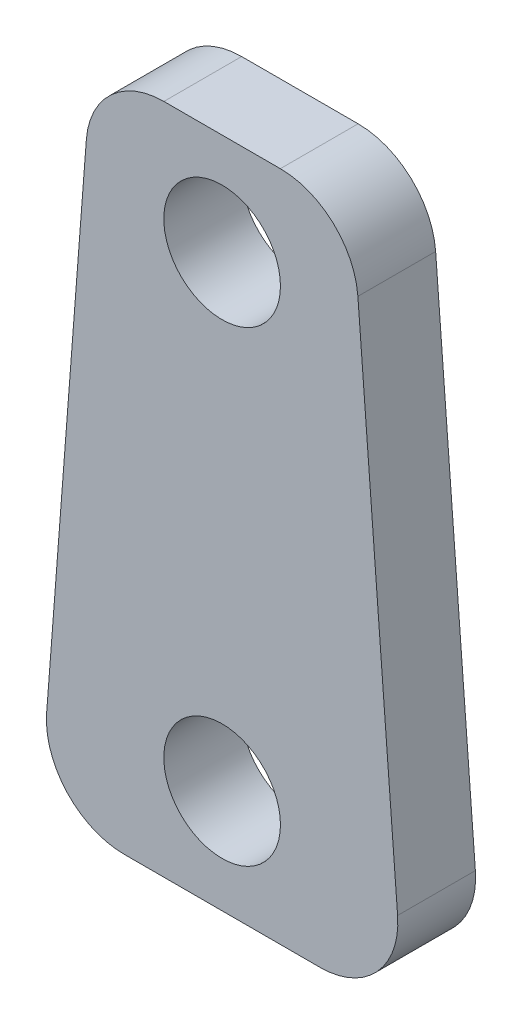
ISO-10303-21;
HEADER;
FILE_DESCRIPTION(('STEP AP214'),'2;1');
FILE_NAME('part.step','',(''),(''),'','','');
FILE_SCHEMA(('AUTOMOTIVE_DESIGN { 1 0 10303 214 1 1 1 1 }'));
ENDSEC;
DATA;
#1=APPLICATION_CONTEXT('core data for automotive mechanical design processes');
#2=APPLICATION_PROTOCOL_DEFINITION('international standard','automotive_design',2000,#1);
#3=PRODUCT_CONTEXT('',#1,'mechanical');
#4=PRODUCT('Part','Part','',(#3));
#5=PRODUCT_RELATED_PRODUCT_CATEGORY('part','',(#4));
#6=PRODUCT_DEFINITION_FORMATION('','',#4);
#7=PRODUCT_DEFINITION_CONTEXT('part definition',#1,'design');
#8=PRODUCT_DEFINITION('design','',#6,#7);
#9=PRODUCT_DEFINITION_SHAPE('','',#8);
#10=(LENGTH_UNIT() NAMED_UNIT(*) SI_UNIT(.MILLI.,.METRE.));
#11=(NAMED_UNIT(*) PLANE_ANGLE_UNIT() SI_UNIT($,.RADIAN.));
#12=(NAMED_UNIT(*) SI_UNIT($,.STERADIAN.) SOLID_ANGLE_UNIT());
#13=UNCERTAINTY_MEASURE_WITH_UNIT(LENGTH_MEASURE(1.E-05),#10,'distance_accuracy_value','');
#14=(GEOMETRIC_REPRESENTATION_CONTEXT(3) GLOBAL_UNCERTAINTY_ASSIGNED_CONTEXT((#13)) GLOBAL_UNIT_ASSIGNED_CONTEXT((#10,
#11,#12)) REPRESENTATION_CONTEXT('',''));
#15=CARTESIAN_POINT('',(0.,0.,0.));
#16=DIRECTION('',(0.,0.,1.));
#17=DIRECTION('',(1.,0.,0.));
#18=AXIS2_PLACEMENT_3D('',#15,#16,#17);
#19=CARTESIAN_POINT('',(-2.37756908156125,134.069666666667,3.175));
#20=DIRECTION('',(0.,0.,-1.));
#21=DIRECTION('',(-1.,0.,0.));
#22=AXIS2_PLACEMENT_3D('',#19,#20,#21);
#23=CYLINDRICAL_SURFACE('',#22,3.17500000000001);
#24=CARTESIAN_POINT('',(-2.37756908156125,134.069666666667,0.));
#25=DIRECTION('',(0.,0.,1.));
#26=DIRECTION('',(1.,0.,0.));
#27=AXIS2_PLACEMENT_3D('',#24,#25,#26);
#28=CIRCLE('',#27,3.17500000000001);
#29=CARTESIAN_POINT('',(-5.54321707302877,134.313178050626,0.));
#30=VERTEX_POINT('',#29);
#31=CARTESIAN_POINT('',(-2.37756908156123,137.244666666667,0.));
#32=VERTEX_POINT('',#31);
#33=EDGE_CURVE('E134',#30,#32,#28,.F.);
#34=ORIENTED_EDGE('',*,*,#33,.F.);
#35=DIRECTION('',(0.,0.,-1.));
#36=VECTOR('',#35,1.);
#37=CARTESIAN_POINT('',(-5.54321707302877,134.313178050626,3.175));
#38=LINE('',#37,#36);
#39=CARTESIAN_POINT('',(-5.54321707302877,134.313178050626,3.175));
#40=VERTEX_POINT('',#39);
#41=EDGE_CURVE('E11',#40,#30,#38,.T.);
#42=ORIENTED_EDGE('',*,*,#41,.F.);
#43=CARTESIAN_POINT('',(-2.37756908156125,134.069666666667,3.175));
#44=DIRECTION('',(0.,0.,1.));
#45=DIRECTION('',(1.,0.,0.));
#46=AXIS2_PLACEMENT_3D('',#43,#44,#45);
#47=CIRCLE('',#46,3.17500000000001);
#48=CARTESIAN_POINT('',(-2.37756908156123,137.244666666667,3.175));
#49=VERTEX_POINT('',#48);
#50=EDGE_CURVE('E292',#40,#49,#47,.F.);
#51=ORIENTED_EDGE('',*,*,#50,.T.);
#52=DIRECTION('',(0.,0.,-1.));
#53=VECTOR('',#52,1.);
#54=CARTESIAN_POINT('',(-2.37756908156123,137.244666666667,3.175));
#55=LINE('',#54,#53);
#56=EDGE_CURVE('E50',#49,#32,#55,.T.);
#57=ORIENTED_EDGE('',*,*,#56,.T.);
#58=EDGE_LOOP('',(#34,#42,#51,#57));
#59=FACE_BOUND('',#58,.T.);
#60=ADVANCED_FACE('F33',(#59),#23,.T.);
#61=CARTESIAN_POINT('',(-15.7816176470588,1.2139705882353,3.175));
#62=DIRECTION('',(-0.997054485501582,0.0766964988847372,0.));
#63=DIRECTION('',(-0.0766964988847372,-0.997054485501582,0.));
#64=AXIS2_PLACEMENT_3D('',#61,#62,#63);
#65=PLANE('',#64);
#66=DIRECTION('',(0.0766964988847372,0.997054485501582,0.));
#67=VECTOR('',#66,1.);
#68=CARTESIAN_POINT('',(-15.7816176470588,1.2139705882353,0.));
#69=LINE('',#68,#67);
#70=CARTESIAN_POINT('',(-7.16490938072108,113.231178050626,0.));
#71=VERTEX_POINT('',#70);
#72=EDGE_CURVE('E136',#71,#30,#69,.T.);
#73=ORIENTED_EDGE('',*,*,#72,.F.);
#74=DIRECTION('',(0.,0.,-1.));
#75=VECTOR('',#74,1.);
#76=CARTESIAN_POINT('',(-7.16490938072108,113.231178050626,3.175));
#77=LINE('',#76,#75);
#78=CARTESIAN_POINT('',(-7.16490938072108,113.231178050626,3.175));
#79=VERTEX_POINT('',#78);
#80=EDGE_CURVE('E42',#79,#71,#77,.T.);
#81=ORIENTED_EDGE('',*,*,#80,.F.);
#82=DIRECTION('',(0.0766964988847372,0.997054485501582,0.));
#83=VECTOR('',#82,1.);
#84=CARTESIAN_POINT('',(-15.7816176470588,1.2139705882353,3.175));
#85=LINE('',#84,#83);
#86=EDGE_CURVE('E176',#79,#40,#85,.T.);
#87=ORIENTED_EDGE('',*,*,#86,.T.);
#88=ORIENTED_EDGE('',*,*,#41,.T.);
#89=EDGE_LOOP('',(#73,#81,#87,#88));
#90=FACE_BOUND('',#89,.T.);
#91=ADVANCED_FACE('F175',(#90),#65,.T.);
#92=CARTESIAN_POINT('',(-3.99926138925356,112.987666666667,3.175));
#93=DIRECTION('',(0.,0.,-1.));
#94=DIRECTION('',(-1.,0.,0.));
#95=AXIS2_PLACEMENT_3D('',#92,#93,#94);
#96=CYLINDRICAL_SURFACE('',#95,3.175);
#97=CARTESIAN_POINT('',(-3.99926138925356,112.987666666667,0.));
#98=DIRECTION('',(0.,0.,1.));
#99=DIRECTION('',(1.,0.,0.));
#100=AXIS2_PLACEMENT_3D('',#97,#98,#99);
#101=CIRCLE('',#100,3.175);
#102=CARTESIAN_POINT('',(-3.99926138925354,109.812666666667,0.));
#103=VERTEX_POINT('',#102);
#104=EDGE_CURVE('E139',#71,#103,#101,.T.);
#105=ORIENTED_EDGE('',*,*,#104,.T.);
#106=DIRECTION('',(0.,0.,-1.));
#107=VECTOR('',#106,1.);
#108=CARTESIAN_POINT('',(-3.99926138925354,109.812666666667,3.175));
#109=LINE('',#108,#107);
#110=CARTESIAN_POINT('',(-3.99926138925354,109.812666666667,3.175));
#111=VERTEX_POINT('',#110);
#112=EDGE_CURVE('E160',#111,#103,#109,.T.);
#113=ORIENTED_EDGE('',*,*,#112,.F.);
#114=CARTESIAN_POINT('',(-3.99926138925356,112.987666666667,3.175));
#115=DIRECTION('',(0.,0.,1.));
#116=DIRECTION('',(1.,0.,0.));
#117=AXIS2_PLACEMENT_3D('',#114,#115,#116);
#118=CIRCLE('',#117,3.175);
#119=EDGE_CURVE('E168',#79,#111,#118,.T.);
#120=ORIENTED_EDGE('',*,*,#119,.F.);
#121=ORIENTED_EDGE('',*,*,#80,.T.);
#122=EDGE_LOOP('',(#105,#113,#120,#121));
#123=FACE_BOUND('',#122,.T.);
#124=ADVANCED_FACE('F165',(#123),#96,.T.);
#125=CARTESIAN_POINT('',(0.,109.812666666667,3.175));
#126=DIRECTION('',(0.,1.,0.));
#127=DIRECTION('',(0.,0.,1.));
#128=AXIS2_PLACEMENT_3D('',#125,#126,#127);
#129=PLANE('',#128);
#130=DIRECTION('',(1.,0.,0.));
#131=VECTOR('',#130,1.);
#132=CARTESIAN_POINT('',(0.,109.812666666667,0.));
#133=LINE('',#132,#131);
#134=CARTESIAN_POINT('',(3.99926138925357,109.812666666667,0.));
#135=VERTEX_POINT('',#134);
#136=EDGE_CURVE('E142',#103,#135,#133,.T.);
#137=ORIENTED_EDGE('',*,*,#136,.T.);
#138=DIRECTION('',(0.,0.,-1.));
#139=VECTOR('',#138,1.);
#140=CARTESIAN_POINT('',(3.99926138925357,109.812666666667,3.175));
#141=LINE('',#140,#139);
#142=CARTESIAN_POINT('',(3.99926138925357,109.812666666667,3.175));
#143=VERTEX_POINT('',#142);
#144=EDGE_CURVE('E158',#143,#135,#141,.T.);
#145=ORIENTED_EDGE('',*,*,#144,.F.);
#146=DIRECTION('',(1.,0.,0.));
#147=VECTOR('',#146,1.);
#148=CARTESIAN_POINT('',(0.,109.812666666667,3.175));
#149=LINE('',#148,#147);
#150=EDGE_CURVE('E123',#111,#143,#149,.T.);
#151=ORIENTED_EDGE('',*,*,#150,.F.);
#152=ORIENTED_EDGE('',*,*,#112,.T.);
#153=EDGE_LOOP('',(#137,#145,#151,#152));
#154=FACE_BOUND('',#153,.T.);
#155=ADVANCED_FACE('F258',(#154),#129,.F.);
#156=CARTESIAN_POINT('',(3.9992613892536,112.987666666667,3.175));
#157=DIRECTION('',(0.,0.,-1.));
#158=DIRECTION('',(-1.,0.,0.));
#159=AXIS2_PLACEMENT_3D('',#156,#157,#158);
#160=CYLINDRICAL_SURFACE('',#159,3.175);
#161=CARTESIAN_POINT('',(3.9992613892536,112.987666666667,0.));
#162=DIRECTION('',(0.,0.,1.));
#163=DIRECTION('',(1.,0.,0.));
#164=AXIS2_PLACEMENT_3D('',#161,#162,#163);
#165=CIRCLE('',#164,3.175);
#166=CARTESIAN_POINT('',(7.16490938072112,113.231178050626,0.));
#167=VERTEX_POINT('',#166);
#168=EDGE_CURVE('E145',#167,#135,#165,.F.);
#169=ORIENTED_EDGE('',*,*,#168,.F.);
#170=DIRECTION('',(0.,0.,-1.));
#171=VECTOR('',#170,1.);
#172=CARTESIAN_POINT('',(7.16490938072112,113.231178050626,3.175));
#173=LINE('',#172,#171);
#174=CARTESIAN_POINT('',(7.16490938072112,113.231178050626,3.175));
#175=VERTEX_POINT('',#174);
#176=EDGE_CURVE('E110',#175,#167,#173,.T.);
#177=ORIENTED_EDGE('',*,*,#176,.F.);
#178=CARTESIAN_POINT('',(3.9992613892536,112.987666666667,3.175));
#179=DIRECTION('',(0.,0.,1.));
#180=DIRECTION('',(1.,0.,0.));
#181=AXIS2_PLACEMENT_3D('',#178,#179,#180);
#182=CIRCLE('',#181,3.175);
#183=EDGE_CURVE('E121',#175,#143,#182,.F.);
#184=ORIENTED_EDGE('',*,*,#183,.T.);
#185=ORIENTED_EDGE('',*,*,#144,.T.);
#186=EDGE_LOOP('',(#169,#177,#184,#185));
#187=FACE_BOUND('',#186,.T.);
#188=ADVANCED_FACE('F249',(#187),#160,.T.);
#189=CARTESIAN_POINT('',(15.7816176470588,1.21397058823529,3.175));
#190=DIRECTION('',(0.997054485501582,0.0766964988847368,0.));
#191=DIRECTION('',(-0.0766964988847368,0.997054485501582,0.));
#192=AXIS2_PLACEMENT_3D('',#189,#190,#191);
#193=PLANE('',#192);
#194=DIRECTION('',(0.0766964988847368,-0.997054485501582,0.));
#195=VECTOR('',#194,1.);
#196=CARTESIAN_POINT('',(15.7816176470588,1.21397058823529,0.));
#197=LINE('',#196,#195);
#198=CARTESIAN_POINT('',(5.54321707302882,134.313178050626,0.));
#199=VERTEX_POINT('',#198);
#200=EDGE_CURVE('E107',#199,#167,#197,.T.);
#201=ORIENTED_EDGE('',*,*,#200,.F.);
#202=DIRECTION('',(0.,0.,-1.));
#203=VECTOR('',#202,1.);
#204=CARTESIAN_POINT('',(5.54321707302882,134.313178050626,3.175));
#205=LINE('',#204,#203);
#206=CARTESIAN_POINT('',(5.54321707302882,134.313178050626,3.175));
#207=VERTEX_POINT('',#206);
#208=EDGE_CURVE('E101',#207,#199,#205,.T.);
#209=ORIENTED_EDGE('',*,*,#208,.F.);
#210=DIRECTION('',(0.0766964988847368,-0.997054485501582,0.));
#211=VECTOR('',#210,1.);
#212=CARTESIAN_POINT('',(15.7816176470588,1.21397058823529,3.175));
#213=LINE('',#212,#211);
#214=EDGE_CURVE('E105',#207,#175,#213,.T.);
#215=ORIENTED_EDGE('',*,*,#214,.T.);
#216=ORIENTED_EDGE('',*,*,#176,.T.);
#217=EDGE_LOOP('',(#201,#209,#215,#216));
#218=FACE_BOUND('',#217,.T.);
#219=ADVANCED_FACE('F103',(#218),#193,.T.);
#220=CARTESIAN_POINT('',(2.37756908156129,134.069666666667,3.175));
#221=DIRECTION('',(0.,0.,-1.));
#222=DIRECTION('',(-1.,0.,0.));
#223=AXIS2_PLACEMENT_3D('',#220,#221,#222);
#224=CYLINDRICAL_SURFACE('',#223,3.17500000000001);
#225=CARTESIAN_POINT('',(2.37756908156129,134.069666666667,0.));
#226=DIRECTION('',(0.,0.,1.));
#227=DIRECTION('',(1.,0.,0.));
#228=AXIS2_PLACEMENT_3D('',#225,#226,#227);
#229=CIRCLE('',#228,3.17500000000001);
#230=CARTESIAN_POINT('',(2.37756908156127,137.244666666667,0.));
#231=VERTEX_POINT('',#230);
#232=EDGE_CURVE('E149',#199,#231,#229,.T.);
#233=ORIENTED_EDGE('',*,*,#232,.T.);
#234=DIRECTION('',(0.,0.,-1.));
#235=VECTOR('',#234,1.);
#236=CARTESIAN_POINT('',(2.37756908156127,137.244666666667,3.175));
#237=LINE('',#236,#235);
#238=CARTESIAN_POINT('',(2.37756908156127,137.244666666667,3.175));
#239=VERTEX_POINT('',#238);
#240=EDGE_CURVE('E76',#239,#231,#237,.T.);
#241=ORIENTED_EDGE('',*,*,#240,.F.);
#242=CARTESIAN_POINT('',(2.37756908156129,134.069666666667,3.175));
#243=DIRECTION('',(0.,0.,1.));
#244=DIRECTION('',(1.,0.,0.));
#245=AXIS2_PLACEMENT_3D('',#242,#243,#244);
#246=CIRCLE('',#245,3.17500000000001);
#247=EDGE_CURVE('E112',#207,#239,#246,.T.);
#248=ORIENTED_EDGE('',*,*,#247,.F.);
#249=ORIENTED_EDGE('',*,*,#208,.T.);
#250=EDGE_LOOP('',(#233,#241,#248,#249));
#251=FACE_BOUND('',#250,.T.);
#252=ADVANCED_FACE('F113',(#251),#224,.T.);
#253=CARTESIAN_POINT('',(0.,133.096000084667,3.175));
#254=DIRECTION('',(0.,0.,-1.));
#255=DIRECTION('',(-1.,0.,0.));
#256=AXIS2_PLACEMENT_3D('',#253,#254,#255);
#257=CYLINDRICAL_SURFACE('',#256,2.38125);
#258=CARTESIAN_POINT('',(0.,133.096000084667,3.175));
#259=DIRECTION('',(0.,0.,1.));
#260=DIRECTION('',(1.,0.,0.));
#261=AXIS2_PLACEMENT_3D('',#258,#259,#260);
#262=CIRCLE('',#261,2.38125);
#263=CARTESIAN_POINT('',(2.38125,133.096000084667,3.175));
#264=VERTEX_POINT('',#263);
#265=EDGE_CURVE('E205',#264,#264,#262,.T.);
#266=ORIENTED_EDGE('',*,*,#265,.T.);
#267=EDGE_LOOP('',(#266));
#268=FACE_BOUND('',#267,.T.);
#269=CARTESIAN_POINT('',(0.,133.096000084667,0.));
#270=DIRECTION('',(0.,0.,1.));
#271=DIRECTION('',(1.,0.,0.));
#272=AXIS2_PLACEMENT_3D('',#269,#270,#271);
#273=CIRCLE('',#272,2.38125);
#274=CARTESIAN_POINT('',(2.38125,133.096000084667,0.));
#275=VERTEX_POINT('',#274);
#276=EDGE_CURVE('E131',#275,#275,#273,.T.);
#277=ORIENTED_EDGE('',*,*,#276,.F.);
#278=EDGE_LOOP('',(#277));
#279=FACE_BOUND('',#278,.T.);
#280=ADVANCED_FACE('F186',(#268,#279),#257,.F.);
#281=CARTESIAN_POINT('',(0.,114.046000084667,3.175));
#282=DIRECTION('',(0.,0.,-1.));
#283=DIRECTION('',(-1.,0.,0.));
#284=AXIS2_PLACEMENT_3D('',#281,#282,#283);
#285=CYLINDRICAL_SURFACE('',#284,2.38125);
#286=CARTESIAN_POINT('',(0.,114.046000084667,3.175));
#287=DIRECTION('',(0.,0.,1.));
#288=DIRECTION('',(1.,0.,0.));
#289=AXIS2_PLACEMENT_3D('',#286,#287,#288);
#290=CIRCLE('',#289,2.38125);
#291=CARTESIAN_POINT('',(2.38125,114.046000084667,3.175));
#292=VERTEX_POINT('',#291);
#293=EDGE_CURVE('E154',#292,#292,#290,.T.);
#294=ORIENTED_EDGE('',*,*,#293,.T.);
#295=EDGE_LOOP('',(#294));
#296=FACE_BOUND('',#295,.T.);
#297=CARTESIAN_POINT('',(0.,114.046000084667,0.));
#298=DIRECTION('',(0.,0.,1.));
#299=DIRECTION('',(1.,0.,0.));
#300=AXIS2_PLACEMENT_3D('',#297,#298,#299);
#301=CIRCLE('',#300,2.38125);
#302=CARTESIAN_POINT('',(2.38125,114.046000084667,0.));
#303=VERTEX_POINT('',#302);
#304=EDGE_CURVE('E128',#303,#303,#301,.T.);
#305=ORIENTED_EDGE('',*,*,#304,.F.);
#306=EDGE_LOOP('',(#305));
#307=FACE_BOUND('',#306,.T.);
#308=ADVANCED_FACE('F35',(#296,#307),#285,.F.);
#309=CARTESIAN_POINT('',(0.,137.244666666667,3.175));
#310=DIRECTION('',(0.,1.,0.));
#311=DIRECTION('',(0.,0.,1.));
#312=AXIS2_PLACEMENT_3D('',#309,#310,#311);
#313=PLANE('',#312);
#314=DIRECTION('',(1.,0.,0.));
#315=VECTOR('',#314,1.);
#316=CARTESIAN_POINT('',(0.,137.244666666667,0.));
#317=LINE('',#316,#315);
#318=EDGE_CURVE('E151',#32,#231,#317,.T.);
#319=ORIENTED_EDGE('',*,*,#318,.F.);
#320=ORIENTED_EDGE('',*,*,#56,.F.);
#321=DIRECTION('',(1.,0.,0.));
#322=VECTOR('',#321,1.);
#323=CARTESIAN_POINT('',(0.,137.244666666667,3.175));
#324=LINE('',#323,#322);
#325=EDGE_CURVE('E116',#49,#239,#324,.T.);
#326=ORIENTED_EDGE('',*,*,#325,.T.);
#327=ORIENTED_EDGE('',*,*,#240,.T.);
#328=EDGE_LOOP('',(#319,#320,#326,#327));
#329=FACE_BOUND('',#328,.T.);
#330=ADVANCED_FACE('F177',(#329),#313,.T.);
#331=CARTESIAN_POINT('',(0.,0.,3.175));
#332=DIRECTION('',(0.,0.,1.));
#333=DIRECTION('',(1.,0.,0.));
#334=AXIS2_PLACEMENT_3D('',#331,#332,#333);
#335=PLANE('',#334);
#336=ORIENTED_EDGE('',*,*,#293,.F.);
#337=EDGE_LOOP('',(#336));
#338=FACE_BOUND('',#337,.T.);
#339=ORIENTED_EDGE('',*,*,#265,.F.);
#340=EDGE_LOOP('',(#339));
#341=FACE_BOUND('',#340,.T.);
#342=ORIENTED_EDGE('',*,*,#50,.F.);
#343=ORIENTED_EDGE('',*,*,#86,.F.);
#344=ORIENTED_EDGE('',*,*,#119,.T.);
#345=ORIENTED_EDGE('',*,*,#150,.T.);
#346=ORIENTED_EDGE('',*,*,#183,.F.);
#347=ORIENTED_EDGE('',*,*,#214,.F.);
#348=ORIENTED_EDGE('',*,*,#247,.T.);
#349=ORIENTED_EDGE('',*,*,#325,.F.);
#350=EDGE_LOOP('',(#342,#343,#344,#345,#346,#347,#348,#349));
#351=FACE_BOUND('',#350,.T.);
#352=ADVANCED_FACE('F119',(#338,#341,#351),#335,.T.);
#353=CARTESIAN_POINT('',(0.,0.,0.));
#354=DIRECTION('',(0.,0.,1.));
#355=DIRECTION('',(1.,0.,0.));
#356=AXIS2_PLACEMENT_3D('',#353,#354,#355);
#357=PLANE('',#356);
#358=ORIENTED_EDGE('',*,*,#304,.T.);
#359=EDGE_LOOP('',(#358));
#360=FACE_BOUND('',#359,.T.);
#361=ORIENTED_EDGE('',*,*,#276,.T.);
#362=EDGE_LOOP('',(#361));
#363=FACE_BOUND('',#362,.T.);
#364=ORIENTED_EDGE('',*,*,#33,.T.);
#365=ORIENTED_EDGE('',*,*,#318,.T.);
#366=ORIENTED_EDGE('',*,*,#232,.F.);
#367=ORIENTED_EDGE('',*,*,#200,.T.);
#368=ORIENTED_EDGE('',*,*,#168,.T.);
#369=ORIENTED_EDGE('',*,*,#136,.F.);
#370=ORIENTED_EDGE('',*,*,#104,.F.);
#371=ORIENTED_EDGE('',*,*,#72,.T.);
#372=EDGE_LOOP('',(#364,#365,#366,#367,#368,#369,#370,#371));
#373=FACE_BOUND('',#372,.T.);
#374=ADVANCED_FACE('F174',(#360,#363,#373),#357,.F.);
#375=CLOSED_SHELL('',(#60,#91,#124,#155,#188,#219,#252,#280,#308,#330,#352,#374));
#376=MANIFOLD_SOLID_BREP('B2',#375);
#377=ADVANCED_BREP_SHAPE_REPRESENTATION('',(#18,#376),#14);
#378=SHAPE_DEFINITION_REPRESENTATION(#9,#377);
ENDSEC;
END-ISO-10303-21;
